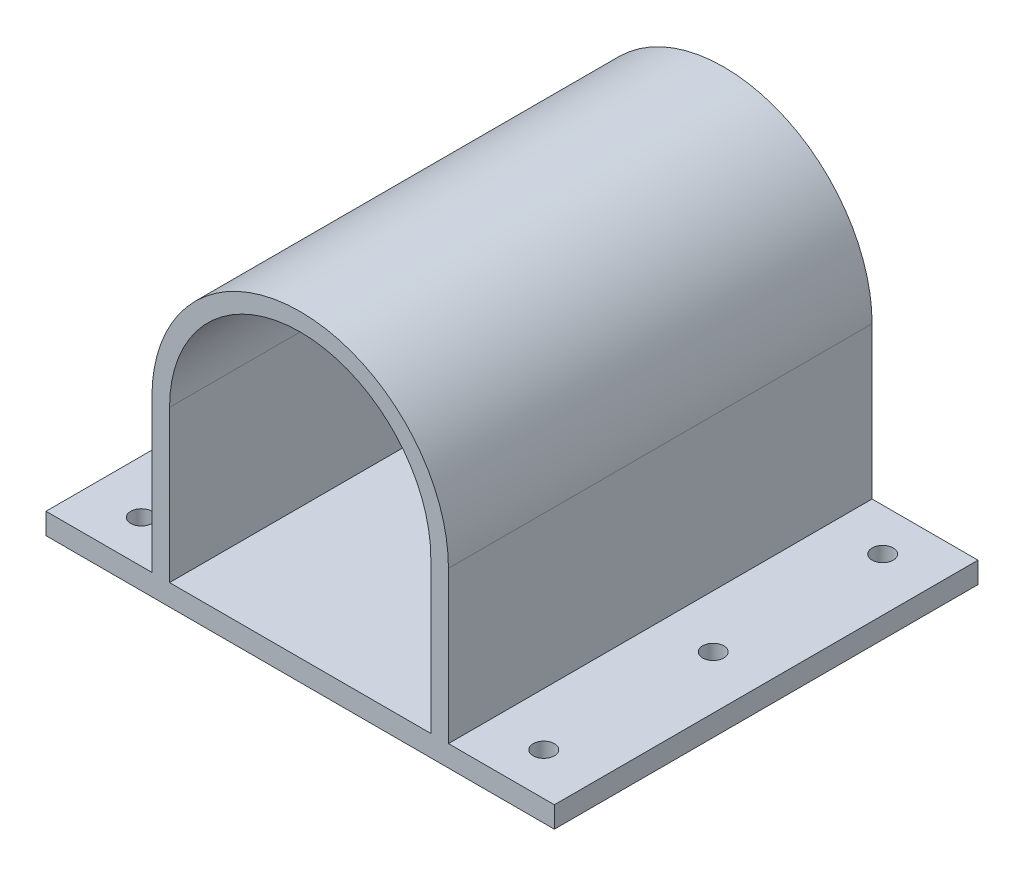
ISO-10303-21;
HEADER;
FILE_DESCRIPTION(('STEP AP214'),'2;1');
FILE_NAME('part.step','',(''),(''),'','','');
FILE_SCHEMA(('AUTOMOTIVE_DESIGN { 1 0 10303 214 1 1 1 1 }'));
ENDSEC;
DATA;
#1=APPLICATION_CONTEXT('core data for automotive mechanical design processes');
#2=APPLICATION_PROTOCOL_DEFINITION('international standard','automotive_design',2000,#1);
#3=PRODUCT_CONTEXT('',#1,'mechanical');
#4=PRODUCT('Part','Part','',(#3));
#5=PRODUCT_RELATED_PRODUCT_CATEGORY('part','',(#4));
#6=PRODUCT_DEFINITION_FORMATION('','',#4);
#7=PRODUCT_DEFINITION_CONTEXT('part definition',#1,'design');
#8=PRODUCT_DEFINITION('design','',#6,#7);
#9=PRODUCT_DEFINITION_SHAPE('','',#8);
#10=(LENGTH_UNIT() NAMED_UNIT(*) SI_UNIT(.MILLI.,.METRE.));
#11=(NAMED_UNIT(*) PLANE_ANGLE_UNIT() SI_UNIT($,.RADIAN.));
#12=(NAMED_UNIT(*) SI_UNIT($,.STERADIAN.) SOLID_ANGLE_UNIT());
#13=UNCERTAINTY_MEASURE_WITH_UNIT(LENGTH_MEASURE(1.E-05),#10,'distance_accuracy_value','');
#14=(GEOMETRIC_REPRESENTATION_CONTEXT(3) GLOBAL_UNCERTAINTY_ASSIGNED_CONTEXT((#13)) GLOBAL_UNIT_ASSIGNED_CONTEXT((#10,
#11,#12)) REPRESENTATION_CONTEXT('',''));
#15=CARTESIAN_POINT('',(0.,0.,0.));
#16=DIRECTION('',(0.,0.,1.));
#17=DIRECTION('',(1.,0.,0.));
#18=AXIS2_PLACEMENT_3D('',#15,#16,#17);
#19=CARTESIAN_POINT('',(0.,-15.5,60.));
#20=DIRECTION('',(0.,0.,-1.));
#21=DIRECTION('',(-1.,0.,0.));
#22=AXIS2_PLACEMENT_3D('',#19,#20,#21);
#23=CYLINDRICAL_SURFACE('',#22,1.65);
#24=CARTESIAN_POINT('',(0.,-15.5,0.));
#25=DIRECTION('',(0.,0.,1.));
#26=DIRECTION('',(1.,0.,0.));
#27=AXIS2_PLACEMENT_3D('',#24,#25,#26);
#28=CIRCLE('',#27,1.65);
#29=CARTESIAN_POINT('',(1.65000000000006,-15.5,0.));
#30=VERTEX_POINT('',#29);
#31=EDGE_CURVE('E216',#30,#30,#28,.T.);
#32=ORIENTED_EDGE('',*,*,#31,.F.);
#33=EDGE_LOOP('',(#32));
#34=FACE_BOUND('',#33,.T.);
#35=CARTESIAN_POINT('',(0.,-15.5,3.));
#36=DIRECTION('',(0.,0.,1.));
#37=DIRECTION('',(1.,0.,0.));
#38=AXIS2_PLACEMENT_3D('',#35,#36,#37);
#39=CIRCLE('',#38,1.65);
#40=CARTESIAN_POINT('',(1.65000000000006,-15.5,3.));
#41=VERTEX_POINT('',#40);
#42=EDGE_CURVE('E195',#41,#41,#39,.T.);
#43=ORIENTED_EDGE('',*,*,#42,.T.);
#44=EDGE_LOOP('',(#43));
#45=FACE_BOUND('',#44,.T.);
#46=ADVANCED_FACE('F39',(#34,#45),#23,.F.);
#47=CARTESIAN_POINT('',(-7.,0.,60.));
#48=DIRECTION('',(0.,0.,-1.));
#49=DIRECTION('',(-1.,0.,0.));
#50=AXIS2_PLACEMENT_3D('',#47,#48,#49);
#51=CYLINDRICAL_SURFACE('',#50,6.15);
#52=CARTESIAN_POINT('',(-7.,0.,0.));
#53=DIRECTION('',(0.,0.,1.));
#54=DIRECTION('',(1.,0.,0.));
#55=AXIS2_PLACEMENT_3D('',#52,#53,#54);
#56=CIRCLE('',#55,6.15);
#57=CARTESIAN_POINT('',(-0.85,0.,0.));
#58=VERTEX_POINT('',#57);
#59=EDGE_CURVE('E213',#58,#58,#56,.T.);
#60=ORIENTED_EDGE('',*,*,#59,.F.);
#61=EDGE_LOOP('',(#60));
#62=FACE_BOUND('',#61,.T.);
#63=CARTESIAN_POINT('',(-7.,0.,3.));
#64=DIRECTION('',(0.,0.,1.));
#65=DIRECTION('',(1.,0.,0.));
#66=AXIS2_PLACEMENT_3D('',#63,#64,#65);
#67=CIRCLE('',#66,6.15);
#68=CARTESIAN_POINT('',(-0.85,0.,3.));
#69=VERTEX_POINT('',#68);
#70=EDGE_CURVE('E192',#69,#69,#67,.T.);
#71=ORIENTED_EDGE('',*,*,#70,.T.);
#72=EDGE_LOOP('',(#71));
#73=FACE_BOUND('',#72,.T.);
#74=ADVANCED_FACE('F308',(#62,#73),#51,.F.);
#75=CARTESIAN_POINT('',(-13.4233937586588,-7.75000000000005,60.));
#76=DIRECTION('',(0.,0.,-1.));
#77=DIRECTION('',(-1.,0.,0.));
#78=AXIS2_PLACEMENT_3D('',#75,#76,#77);
#79=CYLINDRICAL_SURFACE('',#78,1.65);
#80=CARTESIAN_POINT('',(-13.4233937586588,-7.75000000000005,0.));
#81=DIRECTION('',(0.,0.,1.));
#82=DIRECTION('',(1.,0.,0.));
#83=AXIS2_PLACEMENT_3D('',#80,#81,#82);
#84=CIRCLE('',#83,1.65);
#85=CARTESIAN_POINT('',(-11.7733937586588,-7.75000000000005,0.));
#86=VERTEX_POINT('',#85);
#87=EDGE_CURVE('E210',#86,#86,#84,.T.);
#88=ORIENTED_EDGE('',*,*,#87,.F.);
#89=EDGE_LOOP('',(#88));
#90=FACE_BOUND('',#89,.T.);
#91=CARTESIAN_POINT('',(-13.4233937586588,-7.75000000000005,3.));
#92=DIRECTION('',(0.,0.,1.));
#93=DIRECTION('',(1.,0.,0.));
#94=AXIS2_PLACEMENT_3D('',#91,#92,#93);
#95=CIRCLE('',#94,1.65);
#96=CARTESIAN_POINT('',(-11.7733937586588,-7.75000000000005,3.));
#97=VERTEX_POINT('',#96);
#98=EDGE_CURVE('E189',#97,#97,#95,.T.);
#99=ORIENTED_EDGE('',*,*,#98,.T.);
#100=EDGE_LOOP('',(#99));
#101=FACE_BOUND('',#100,.T.);
#102=ADVANCED_FACE('F315',(#90,#101),#79,.F.);
#103=CARTESIAN_POINT('',(-13.4233937586588,7.74999999999994,60.));
#104=DIRECTION('',(0.,0.,-1.));
#105=DIRECTION('',(-1.,0.,0.));
#106=AXIS2_PLACEMENT_3D('',#103,#104,#105);
#107=CYLINDRICAL_SURFACE('',#106,1.65);
#108=CARTESIAN_POINT('',(-13.4233937586588,7.74999999999994,0.));
#109=DIRECTION('',(0.,0.,1.));
#110=DIRECTION('',(1.,0.,0.));
#111=AXIS2_PLACEMENT_3D('',#108,#109,#110);
#112=CIRCLE('',#111,1.65);
#113=CARTESIAN_POINT('',(-11.7733937586588,7.74999999999994,0.));
#114=VERTEX_POINT('',#113);
#115=EDGE_CURVE('E207',#114,#114,#112,.T.);
#116=ORIENTED_EDGE('',*,*,#115,.F.);
#117=EDGE_LOOP('',(#116));
#118=FACE_BOUND('',#117,.T.);
#119=CARTESIAN_POINT('',(-13.4233937586588,7.74999999999994,3.));
#120=DIRECTION('',(0.,0.,1.));
#121=DIRECTION('',(1.,0.,0.));
#122=AXIS2_PLACEMENT_3D('',#119,#120,#121);
#123=CIRCLE('',#122,1.65);
#124=CARTESIAN_POINT('',(-11.7733937586588,7.74999999999994,3.));
#125=VERTEX_POINT('',#124);
#126=EDGE_CURVE('E186',#125,#125,#123,.T.);
#127=ORIENTED_EDGE('',*,*,#126,.T.);
#128=EDGE_LOOP('',(#127));
#129=FACE_BOUND('',#128,.T.);
#130=ADVANCED_FACE('F420',(#118,#129),#107,.F.);
#131=CARTESIAN_POINT('',(0.,15.5,60.));
#132=DIRECTION('',(0.,0.,-1.));
#133=DIRECTION('',(-1.,0.,0.));
#134=AXIS2_PLACEMENT_3D('',#131,#132,#133);
#135=CYLINDRICAL_SURFACE('',#134,1.65);
#136=CARTESIAN_POINT('',(0.,15.5,0.));
#137=DIRECTION('',(0.,0.,1.));
#138=DIRECTION('',(1.,0.,0.));
#139=AXIS2_PLACEMENT_3D('',#136,#137,#138);
#140=CIRCLE('',#139,1.65);
#141=CARTESIAN_POINT('',(1.64999999999994,15.5,0.));
#142=VERTEX_POINT('',#141);
#143=EDGE_CURVE('E204',#142,#142,#140,.T.);
#144=ORIENTED_EDGE('',*,*,#143,.F.);
#145=EDGE_LOOP('',(#144));
#146=FACE_BOUND('',#145,.T.);
#147=CARTESIAN_POINT('',(0.,15.5,3.));
#148=DIRECTION('',(0.,0.,1.));
#149=DIRECTION('',(1.,0.,0.));
#150=AXIS2_PLACEMENT_3D('',#147,#148,#149);
#151=CIRCLE('',#150,1.65);
#152=CARTESIAN_POINT('',(1.64999999999994,15.5,3.));
#153=VERTEX_POINT('',#152);
#154=EDGE_CURVE('E183',#153,#153,#151,.T.);
#155=ORIENTED_EDGE('',*,*,#154,.T.);
#156=EDGE_LOOP('',(#155));
#157=FACE_BOUND('',#156,.T.);
#158=ADVANCED_FACE('F416',(#146,#157),#135,.F.);
#159=CARTESIAN_POINT('',(13.4233937586588,7.75000000000006,60.));
#160=DIRECTION('',(0.,0.,-1.));
#161=DIRECTION('',(-1.,0.,0.));
#162=AXIS2_PLACEMENT_3D('',#159,#160,#161);
#163=CYLINDRICAL_SURFACE('',#162,1.65);
#164=CARTESIAN_POINT('',(13.4233937586588,7.75000000000006,0.));
#165=DIRECTION('',(0.,0.,1.));
#166=DIRECTION('',(1.,0.,0.));
#167=AXIS2_PLACEMENT_3D('',#164,#165,#166);
#168=CIRCLE('',#167,1.65);
#169=CARTESIAN_POINT('',(15.0733937586588,7.75000000000006,0.));
#170=VERTEX_POINT('',#169);
#171=EDGE_CURVE('E201',#170,#170,#168,.T.);
#172=ORIENTED_EDGE('',*,*,#171,.F.);
#173=EDGE_LOOP('',(#172));
#174=FACE_BOUND('',#173,.T.);
#175=CARTESIAN_POINT('',(13.4233937586588,7.75000000000006,3.));
#176=DIRECTION('',(0.,0.,1.));
#177=DIRECTION('',(1.,0.,0.));
#178=AXIS2_PLACEMENT_3D('',#175,#176,#177);
#179=CIRCLE('',#178,1.65);
#180=CARTESIAN_POINT('',(15.0733937586588,7.75000000000006,3.));
#181=VERTEX_POINT('',#180);
#182=EDGE_CURVE('E180',#181,#181,#179,.T.);
#183=ORIENTED_EDGE('',*,*,#182,.T.);
#184=EDGE_LOOP('',(#183));
#185=FACE_BOUND('',#184,.T.);
#186=ADVANCED_FACE('F382',(#174,#185),#163,.F.);
#187=CARTESIAN_POINT('',(13.4233937586588,-7.74999999999995,60.));
#188=DIRECTION('',(0.,0.,-1.));
#189=DIRECTION('',(-1.,0.,0.));
#190=AXIS2_PLACEMENT_3D('',#187,#188,#189);
#191=CYLINDRICAL_SURFACE('',#190,1.65);
#192=CARTESIAN_POINT('',(13.4233937586588,-7.74999999999995,0.));
#193=DIRECTION('',(0.,0.,1.));
#194=DIRECTION('',(1.,0.,0.));
#195=AXIS2_PLACEMENT_3D('',#192,#193,#194);
#196=CIRCLE('',#195,1.65);
#197=CARTESIAN_POINT('',(15.0733937586588,-7.74999999999995,0.));
#198=VERTEX_POINT('',#197);
#199=EDGE_CURVE('E198',#198,#198,#196,.T.);
#200=ORIENTED_EDGE('',*,*,#199,.F.);
#201=EDGE_LOOP('',(#200));
#202=FACE_BOUND('',#201,.T.);
#203=CARTESIAN_POINT('',(13.4233937586588,-7.74999999999995,3.));
#204=DIRECTION('',(0.,0.,1.));
#205=DIRECTION('',(1.,0.,0.));
#206=AXIS2_PLACEMENT_3D('',#203,#204,#205);
#207=CIRCLE('',#206,1.65);
#208=CARTESIAN_POINT('',(15.0733937586588,-7.74999999999995,3.));
#209=VERTEX_POINT('',#208);
#210=EDGE_CURVE('E176',#209,#209,#207,.T.);
#211=ORIENTED_EDGE('',*,*,#210,.T.);
#212=EDGE_LOOP('',(#211));
#213=FACE_BOUND('',#212,.T.);
#214=ADVANCED_FACE('F325',(#202,#213),#191,.F.);
#215=CARTESIAN_POINT('',(0.,0.,60.));
#216=DIRECTION('',(0.,0.,1.));
#217=DIRECTION('',(1.,0.,0.));
#218=AXIS2_PLACEMENT_3D('',#215,#216,#217);
#219=PLANE('',#218);
#220=CARTESIAN_POINT('',(0.,0.,60.));
#221=DIRECTION('',(0.,0.,1.));
#222=DIRECTION('',(1.,0.,0.));
#223=AXIS2_PLACEMENT_3D('',#220,#221,#222);
#224=CIRCLE('',#223,18.5);
#225=CARTESIAN_POINT('',(18.5,0.,60.));
#226=VERTEX_POINT('',#225);
#227=CARTESIAN_POINT('',(-18.5,0.,60.));
#228=VERTEX_POINT('',#227);
#229=EDGE_CURVE('E140',#226,#228,#224,.T.);
#230=ORIENTED_EDGE('',*,*,#229,.F.);
#231=DIRECTION('',(0.,1.,0.));
#232=VECTOR('',#231,1.);
#233=CARTESIAN_POINT('',(18.5,-21.5,60.));
#234=LINE('',#233,#232);
#235=CARTESIAN_POINT('',(18.5,-21.5,60.));
#236=VERTEX_POINT('',#235);
#237=EDGE_CURVE('E157',#236,#226,#234,.T.);
#238=ORIENTED_EDGE('',*,*,#237,.F.);
#239=DIRECTION('',(1.,0.,0.));
#240=VECTOR('',#239,1.);
#241=CARTESIAN_POINT('',(-18.5,-21.5,60.));
#242=LINE('',#241,#240);
#243=CARTESIAN_POINT('',(-18.5,-21.5,60.));
#244=VERTEX_POINT('',#243);
#245=EDGE_CURVE('E160',#244,#236,#242,.T.);
#246=ORIENTED_EDGE('',*,*,#245,.F.);
#247=DIRECTION('',(0.,-1.,0.));
#248=VECTOR('',#247,1.);
#249=CARTESIAN_POINT('',(-18.5,0.,60.));
#250=LINE('',#249,#248);
#251=EDGE_CURVE('E169',#228,#244,#250,.T.);
#252=ORIENTED_EDGE('',*,*,#251,.F.);
#253=EDGE_LOOP('',(#230,#238,#246,#252));
#254=FACE_BOUND('',#253,.T.);
#255=CARTESIAN_POINT('',(0.,0.,60.));
#256=DIRECTION('',(0.,0.,1.));
#257=DIRECTION('',(1.,0.,0.));
#258=AXIS2_PLACEMENT_3D('',#255,#256,#257);
#259=CIRCLE('',#258,21.);
#260=CARTESIAN_POINT('',(21.,0.,60.));
#261=VERTEX_POINT('',#260);
#262=CARTESIAN_POINT('',(-21.,0.,60.));
#263=VERTEX_POINT('',#262);
#264=EDGE_CURVE('E220',#261,#263,#259,.T.);
#265=ORIENTED_EDGE('',*,*,#264,.T.);
#266=DIRECTION('',(0.,-1.,0.));
#267=VECTOR('',#266,1.);
#268=CARTESIAN_POINT('',(-21.,0.,60.));
#269=LINE('',#268,#267);
#270=CARTESIAN_POINT('',(-21.,-21.5,60.));
#271=VERTEX_POINT('',#270);
#272=EDGE_CURVE('E223',#263,#271,#269,.T.);
#273=ORIENTED_EDGE('',*,*,#272,.T.);
#274=DIRECTION('',(-1.,0.,0.));
#275=VECTOR('',#274,1.);
#276=CARTESIAN_POINT('',(-21.,-21.5,60.));
#277=LINE('',#276,#275);
#278=CARTESIAN_POINT('',(-36.,-21.5,60.));
#279=VERTEX_POINT('',#278);
#280=EDGE_CURVE('E226',#271,#279,#277,.T.);
#281=ORIENTED_EDGE('',*,*,#280,.T.);
#282=DIRECTION('',(0.,-1.,0.));
#283=VECTOR('',#282,1.);
#284=CARTESIAN_POINT('',(-36.,-21.5,60.));
#285=LINE('',#284,#283);
#286=CARTESIAN_POINT('',(-36.,-24.5,60.));
#287=VERTEX_POINT('',#286);
#288=EDGE_CURVE('E228',#279,#287,#285,.T.);
#289=ORIENTED_EDGE('',*,*,#288,.T.);
#290=DIRECTION('',(1.,0.,0.));
#291=VECTOR('',#290,1.);
#292=CARTESIAN_POINT('',(-36.,-24.5,60.));
#293=LINE('',#292,#291);
#294=CARTESIAN_POINT('',(36.,-24.5,60.));
#295=VERTEX_POINT('',#294);
#296=EDGE_CURVE('E230',#287,#295,#293,.T.);
#297=ORIENTED_EDGE('',*,*,#296,.T.);
#298=DIRECTION('',(0.,1.,0.));
#299=VECTOR('',#298,1.);
#300=CARTESIAN_POINT('',(36.,-24.5,60.));
#301=LINE('',#300,#299);
#302=CARTESIAN_POINT('',(36.,-21.5,60.));
#303=VERTEX_POINT('',#302);
#304=EDGE_CURVE('E232',#295,#303,#301,.T.);
#305=ORIENTED_EDGE('',*,*,#304,.T.);
#306=DIRECTION('',(-1.,0.,0.));
#307=VECTOR('',#306,1.);
#308=CARTESIAN_POINT('',(36.,-21.5,60.));
#309=LINE('',#308,#307);
#310=CARTESIAN_POINT('',(21.,-21.5,60.));
#311=VERTEX_POINT('',#310);
#312=EDGE_CURVE('E234',#303,#311,#309,.T.);
#313=ORIENTED_EDGE('',*,*,#312,.T.);
#314=DIRECTION('',(0.,1.,0.));
#315=VECTOR('',#314,1.);
#316=CARTESIAN_POINT('',(21.,-21.5,60.));
#317=LINE('',#316,#315);
#318=EDGE_CURVE('E236',#311,#261,#317,.T.);
#319=ORIENTED_EDGE('',*,*,#318,.T.);
#320=EDGE_LOOP('',(#265,#273,#281,#289,#297,#305,#313,#319));
#321=FACE_BOUND('',#320,.T.);
#322=ADVANCED_FACE('F292',(#254,#321),#219,.T.);
#323=CARTESIAN_POINT('',(0.,0.,0.));
#324=DIRECTION('',(0.,0.,1.));
#325=DIRECTION('',(1.,0.,0.));
#326=AXIS2_PLACEMENT_3D('',#323,#324,#325);
#327=PLANE('',#326);
#328=DIRECTION('',(1.,0.,0.));
#329=VECTOR('',#328,1.);
#330=CARTESIAN_POINT('',(-36.,-24.5,0.));
#331=LINE('',#330,#329);
#332=CARTESIAN_POINT('',(-30.,-24.5,0.));
#333=VERTEX_POINT('',#332);
#334=CARTESIAN_POINT('',(36.,-24.5,0.));
#335=VERTEX_POINT('',#334);
#336=EDGE_CURVE('E245',#333,#335,#331,.T.);
#337=ORIENTED_EDGE('',*,*,#336,.F.);
#338=DIRECTION('',(0.,-1.,0.));
#339=VECTOR('',#338,1.);
#340=CARTESIAN_POINT('',(-30.,0.,0.));
#341=LINE('',#340,#339);
#342=CARTESIAN_POINT('',(-30.,-21.5,0.));
#343=VERTEX_POINT('',#342);
#344=EDGE_CURVE('E47',#333,#343,#341,.F.);
#345=ORIENTED_EDGE('',*,*,#344,.T.);
#346=DIRECTION('',(-1.,0.,0.));
#347=VECTOR('',#346,1.);
#348=CARTESIAN_POINT('',(-21.,-21.5,0.));
#349=LINE('',#348,#347);
#350=CARTESIAN_POINT('',(-21.,-21.5,0.));
#351=VERTEX_POINT('',#350);
#352=EDGE_CURVE('E243',#351,#343,#349,.T.);
#353=ORIENTED_EDGE('',*,*,#352,.F.);
#354=DIRECTION('',(0.,-1.,0.));
#355=VECTOR('',#354,1.);
#356=CARTESIAN_POINT('',(-21.,0.,0.));
#357=LINE('',#356,#355);
#358=CARTESIAN_POINT('',(-21.,0.,0.));
#359=VERTEX_POINT('',#358);
#360=EDGE_CURVE('E241',#359,#351,#357,.T.);
#361=ORIENTED_EDGE('',*,*,#360,.F.);
#362=CARTESIAN_POINT('',(0.,0.,0.));
#363=DIRECTION('',(0.,0.,1.));
#364=DIRECTION('',(1.,0.,0.));
#365=AXIS2_PLACEMENT_3D('',#362,#363,#364);
#366=CIRCLE('',#365,21.);
#367=CARTESIAN_POINT('',(21.,0.,0.));
#368=VERTEX_POINT('',#367);
#369=EDGE_CURVE('E219',#368,#359,#366,.T.);
#370=ORIENTED_EDGE('',*,*,#369,.F.);
#371=DIRECTION('',(0.,1.,0.));
#372=VECTOR('',#371,1.);
#373=CARTESIAN_POINT('',(21.,-21.5,0.));
#374=LINE('',#373,#372);
#375=CARTESIAN_POINT('',(21.,-21.5,0.));
#376=VERTEX_POINT('',#375);
#377=EDGE_CURVE('E224',#376,#368,#374,.T.);
#378=ORIENTED_EDGE('',*,*,#377,.F.);
#379=DIRECTION('',(-1.,0.,0.));
#380=VECTOR('',#379,1.);
#381=CARTESIAN_POINT('',(36.,-21.5,0.));
#382=LINE('',#381,#380);
#383=CARTESIAN_POINT('',(36.,-21.5,0.));
#384=VERTEX_POINT('',#383);
#385=EDGE_CURVE('E249',#384,#376,#382,.T.);
#386=ORIENTED_EDGE('',*,*,#385,.F.);
#387=DIRECTION('',(0.,1.,0.));
#388=VECTOR('',#387,1.);
#389=CARTESIAN_POINT('',(36.,-24.5,0.));
#390=LINE('',#389,#388);
#391=EDGE_CURVE('E247',#335,#384,#390,.T.);
#392=ORIENTED_EDGE('',*,*,#391,.F.);
#393=EDGE_LOOP('',(#337,#345,#353,#361,#370,#378,#386,#392));
#394=FACE_BOUND('',#393,.T.);
#395=ORIENTED_EDGE('',*,*,#31,.T.);
#396=EDGE_LOOP('',(#395));
#397=FACE_BOUND('',#396,.T.);
#398=ORIENTED_EDGE('',*,*,#59,.T.);
#399=EDGE_LOOP('',(#398));
#400=FACE_BOUND('',#399,.T.);
#401=ORIENTED_EDGE('',*,*,#87,.T.);
#402=EDGE_LOOP('',(#401));
#403=FACE_BOUND('',#402,.T.);
#404=ORIENTED_EDGE('',*,*,#115,.T.);
#405=EDGE_LOOP('',(#404));
#406=FACE_BOUND('',#405,.T.);
#407=ORIENTED_EDGE('',*,*,#143,.T.);
#408=EDGE_LOOP('',(#407));
#409=FACE_BOUND('',#408,.T.);
#410=ORIENTED_EDGE('',*,*,#171,.T.);
#411=EDGE_LOOP('',(#410));
#412=FACE_BOUND('',#411,.T.);
#413=ORIENTED_EDGE('',*,*,#199,.T.);
#414=EDGE_LOOP('',(#413));
#415=FACE_BOUND('',#414,.T.);
#416=ADVANCED_FACE('F324',(#394,#397,#400,#403,#406,#409,#412,#415),#327,.F.);
#417=CARTESIAN_POINT('',(0.,0.,60.));
#418=DIRECTION('',(0.,0.,-1.));
#419=DIRECTION('',(-1.,0.,0.));
#420=AXIS2_PLACEMENT_3D('',#417,#418,#419);
#421=CYLINDRICAL_SURFACE('',#420,21.);
#422=ORIENTED_EDGE('',*,*,#369,.T.);
#423=DIRECTION('',(0.,0.,-1.));
#424=VECTOR('',#423,1.);
#425=CARTESIAN_POINT('',(-21.,0.,60.));
#426=LINE('',#425,#424);
#427=EDGE_CURVE('E271',#263,#359,#426,.T.);
#428=ORIENTED_EDGE('',*,*,#427,.F.);
#429=ORIENTED_EDGE('',*,*,#264,.F.);
#430=DIRECTION('',(0.,0.,-1.));
#431=VECTOR('',#430,1.);
#432=CARTESIAN_POINT('',(21.,0.,60.));
#433=LINE('',#432,#431);
#434=EDGE_CURVE('E238',#261,#368,#433,.T.);
#435=ORIENTED_EDGE('',*,*,#434,.T.);
#436=EDGE_LOOP('',(#422,#428,#429,#435));
#437=FACE_BOUND('',#436,.T.);
#438=ADVANCED_FACE('F329',(#437),#421,.T.);
#439=CARTESIAN_POINT('',(-21.,0.,60.));
#440=DIRECTION('',(1.,0.,0.));
#441=DIRECTION('',(0.,1.,0.));
#442=AXIS2_PLACEMENT_3D('',#439,#440,#441);
#443=PLANE('',#442);
#444=ORIENTED_EDGE('',*,*,#360,.T.);
#445=DIRECTION('',(0.,0.,-1.));
#446=VECTOR('',#445,1.);
#447=CARTESIAN_POINT('',(-21.,-21.5,60.));
#448=LINE('',#447,#446);
#449=EDGE_CURVE('E268',#271,#351,#448,.T.);
#450=ORIENTED_EDGE('',*,*,#449,.F.);
#451=ORIENTED_EDGE('',*,*,#272,.F.);
#452=ORIENTED_EDGE('',*,*,#427,.T.);
#453=EDGE_LOOP('',(#444,#450,#451,#452));
#454=FACE_BOUND('',#453,.T.);
#455=ADVANCED_FACE('F347',(#454),#443,.F.);
#456=CARTESIAN_POINT('',(-21.,-21.5,60.));
#457=DIRECTION('',(0.,-1.,0.));
#458=DIRECTION('',(0.,0.,-1.));
#459=AXIS2_PLACEMENT_3D('',#456,#457,#458);
#460=PLANE('',#459);
#461=CARTESIAN_POINT('',(-28.5,-21.5,6.));
#462=DIRECTION('',(0.,1.,0.));
#463=DIRECTION('',(0.,0.,1.));
#464=AXIS2_PLACEMENT_3D('',#461,#462,#463);
#465=CIRCLE('',#464,1.5);
#466=CARTESIAN_POINT('',(-28.5,-21.5,7.5));
#467=VERTEX_POINT('',#466);
#468=EDGE_CURVE('E626',#467,#467,#465,.T.);
#469=ORIENTED_EDGE('',*,*,#468,.F.);
#470=EDGE_LOOP('',(#469));
#471=FACE_BOUND('',#470,.T.);
#472=CARTESIAN_POINT('',(-28.5,-21.5,54.));
#473=DIRECTION('',(0.,1.,0.));
#474=DIRECTION('',(0.,0.,1.));
#475=AXIS2_PLACEMENT_3D('',#472,#473,#474);
#476=CIRCLE('',#475,1.5);
#477=CARTESIAN_POINT('',(-28.5,-21.5,55.5));
#478=VERTEX_POINT('',#477);
#479=EDGE_CURVE('E621',#478,#478,#476,.T.);
#480=ORIENTED_EDGE('',*,*,#479,.F.);
#481=EDGE_LOOP('',(#480));
#482=FACE_BOUND('',#481,.T.);
#483=CARTESIAN_POINT('',(-28.5,-21.5,30.));
#484=DIRECTION('',(0.,1.,0.));
#485=DIRECTION('',(0.,0.,1.));
#486=AXIS2_PLACEMENT_3D('',#483,#484,#485);
#487=CIRCLE('',#486,1.5);
#488=CARTESIAN_POINT('',(-28.5,-21.5,31.5));
#489=VERTEX_POINT('',#488);
#490=EDGE_CURVE('E163',#489,#489,#487,.T.);
#491=ORIENTED_EDGE('',*,*,#490,.F.);
#492=EDGE_LOOP('',(#491));
#493=FACE_BOUND('',#492,.T.);
#494=ORIENTED_EDGE('',*,*,#352,.T.);
#495=CARTESIAN_POINT('',(-30.,-21.5,6.));
#496=DIRECTION('',(0.,-1.,0.));
#497=DIRECTION('',(0.,0.,-1.));
#498=AXIS2_PLACEMENT_3D('',#495,#496,#497);
#499=CIRCLE('',#498,6.);
#500=CARTESIAN_POINT('',(-36.,-21.5,6.));
#501=VERTEX_POINT('',#500);
#502=EDGE_CURVE('E11',#343,#501,#499,.F.);
#503=ORIENTED_EDGE('',*,*,#502,.T.);
#504=DIRECTION('',(0.,0.,-1.));
#505=VECTOR('',#504,1.);
#506=CARTESIAN_POINT('',(-36.,-21.5,60.));
#507=LINE('',#506,#505);
#508=EDGE_CURVE('E265',#279,#501,#507,.T.);
#509=ORIENTED_EDGE('',*,*,#508,.F.);
#510=ORIENTED_EDGE('',*,*,#280,.F.);
#511=ORIENTED_EDGE('',*,*,#449,.T.);
#512=EDGE_LOOP('',(#494,#503,#509,#510,#511));
#513=FACE_BOUND('',#512,.T.);
#514=ADVANCED_FACE('F297',(#471,#482,#493,#513),#460,.F.);
#515=CARTESIAN_POINT('',(-36.,-21.5,60.));
#516=DIRECTION('',(1.,0.,0.));
#517=DIRECTION('',(0.,0.,-1.));
#518=AXIS2_PLACEMENT_3D('',#515,#516,#517);
#519=PLANE('',#518);
#520=ORIENTED_EDGE('',*,*,#508,.T.);
#521=DIRECTION('',(0.,-1.,0.));
#522=VECTOR('',#521,1.);
#523=CARTESIAN_POINT('',(-36.,-21.5,6.));
#524=LINE('',#523,#522);
#525=CARTESIAN_POINT('',(-36.,-24.5,6.));
#526=VERTEX_POINT('',#525);
#527=EDGE_CURVE('E274',#501,#526,#524,.T.);
#528=ORIENTED_EDGE('',*,*,#527,.T.);
#529=DIRECTION('',(0.,0.,-1.));
#530=VECTOR('',#529,1.);
#531=CARTESIAN_POINT('',(-36.,-24.5,60.));
#532=LINE('',#531,#530);
#533=EDGE_CURVE('E263',#287,#526,#532,.T.);
#534=ORIENTED_EDGE('',*,*,#533,.F.);
#535=ORIENTED_EDGE('',*,*,#288,.F.);
#536=EDGE_LOOP('',(#520,#528,#534,#535));
#537=FACE_BOUND('',#536,.T.);
#538=ADVANCED_FACE('F282',(#537),#519,.F.);
#539=CARTESIAN_POINT('',(-36.,-24.5,60.));
#540=DIRECTION('',(0.,1.,0.));
#541=DIRECTION('',(0.,0.,1.));
#542=AXIS2_PLACEMENT_3D('',#539,#540,#541);
#543=PLANE('',#542);
#544=CARTESIAN_POINT('',(-28.5,-24.5,6.));
#545=DIRECTION('',(0.,1.,0.));
#546=DIRECTION('',(0.,0.,1.));
#547=AXIS2_PLACEMENT_3D('',#544,#545,#546);
#548=CIRCLE('',#547,1.5);
#549=CARTESIAN_POINT('',(-28.5,-24.5,7.5));
#550=VERTEX_POINT('',#549);
#551=EDGE_CURVE('E623',#550,#550,#548,.T.);
#552=ORIENTED_EDGE('',*,*,#551,.T.);
#553=EDGE_LOOP('',(#552));
#554=FACE_BOUND('',#553,.T.);
#555=CARTESIAN_POINT('',(-28.5,-24.5,54.));
#556=DIRECTION('',(0.,1.,0.));
#557=DIRECTION('',(0.,0.,1.));
#558=AXIS2_PLACEMENT_3D('',#555,#556,#557);
#559=CIRCLE('',#558,1.5);
#560=CARTESIAN_POINT('',(-28.5,-24.5,55.5));
#561=VERTEX_POINT('',#560);
#562=EDGE_CURVE('E618',#561,#561,#559,.T.);
#563=ORIENTED_EDGE('',*,*,#562,.T.);
#564=EDGE_LOOP('',(#563));
#565=FACE_BOUND('',#564,.T.);
#566=CARTESIAN_POINT('',(28.5,-24.5,54.));
#567=DIRECTION('',(0.,1.,0.));
#568=DIRECTION('',(0.,0.,-1.));
#569=AXIS2_PLACEMENT_3D('',#566,#567,#568);
#570=CIRCLE('',#569,1.5);
#571=CARTESIAN_POINT('',(28.5,-24.5,52.5));
#572=VERTEX_POINT('',#571);
#573=EDGE_CURVE('E634',#572,#572,#570,.T.);
#574=ORIENTED_EDGE('',*,*,#573,.T.);
#575=EDGE_LOOP('',(#574));
#576=FACE_BOUND('',#575,.T.);
#577=CARTESIAN_POINT('',(28.5,-24.5,6.00000000000001));
#578=DIRECTION('',(0.,1.,0.));
#579=DIRECTION('',(0.,0.,-1.));
#580=AXIS2_PLACEMENT_3D('',#577,#578,#579);
#581=CIRCLE('',#580,1.5);
#582=CARTESIAN_POINT('',(28.5,-24.5,4.50000000000001));
#583=VERTEX_POINT('',#582);
#584=EDGE_CURVE('E640',#583,#583,#581,.T.);
#585=ORIENTED_EDGE('',*,*,#584,.T.);
#586=EDGE_LOOP('',(#585));
#587=FACE_BOUND('',#586,.T.);
#588=CARTESIAN_POINT('',(28.5,-24.5,30.));
#589=DIRECTION('',(0.,1.,0.));
#590=DIRECTION('',(0.,0.,-1.));
#591=AXIS2_PLACEMENT_3D('',#588,#589,#590);
#592=CIRCLE('',#591,1.5);
#593=CARTESIAN_POINT('',(28.5,-24.5,28.5));
#594=VERTEX_POINT('',#593);
#595=EDGE_CURVE('E653',#594,#594,#592,.T.);
#596=ORIENTED_EDGE('',*,*,#595,.T.);
#597=EDGE_LOOP('',(#596));
#598=FACE_BOUND('',#597,.T.);
#599=CARTESIAN_POINT('',(-28.5,-24.5,30.));
#600=DIRECTION('',(0.,1.,0.));
#601=DIRECTION('',(0.,0.,1.));
#602=AXIS2_PLACEMENT_3D('',#599,#600,#601);
#603=CIRCLE('',#602,1.5);
#604=CARTESIAN_POINT('',(-28.5,-24.5,31.5));
#605=VERTEX_POINT('',#604);
#606=EDGE_CURVE('E170',#605,#605,#603,.T.);
#607=ORIENTED_EDGE('',*,*,#606,.T.);
#608=EDGE_LOOP('',(#607));
#609=FACE_BOUND('',#608,.T.);
#610=ORIENTED_EDGE('',*,*,#533,.T.);
#611=CARTESIAN_POINT('',(-30.,-24.5,6.));
#612=DIRECTION('',(0.,1.,0.));
#613=DIRECTION('',(0.,0.,1.));
#614=AXIS2_PLACEMENT_3D('',#611,#612,#613);
#615=CIRCLE('',#614,6.);
#616=EDGE_CURVE('E61',#526,#333,#615,.F.);
#617=ORIENTED_EDGE('',*,*,#616,.T.);
#618=ORIENTED_EDGE('',*,*,#336,.T.);
#619=DIRECTION('',(0.,0.,-1.));
#620=VECTOR('',#619,1.);
#621=CARTESIAN_POINT('',(36.,-24.5,60.));
#622=LINE('',#621,#620);
#623=EDGE_CURVE('E260',#295,#335,#622,.T.);
#624=ORIENTED_EDGE('',*,*,#623,.F.);
#625=ORIENTED_EDGE('',*,*,#296,.F.);
#626=EDGE_LOOP('',(#610,#617,#618,#624,#625));
#627=FACE_BOUND('',#626,.T.);
#628=ADVANCED_FACE('F288',(#554,#565,#576,#587,#598,#609,#627),#543,.F.);
#629=CARTESIAN_POINT('',(36.,-24.5,60.));
#630=DIRECTION('',(-1.,0.,0.));
#631=DIRECTION('',(0.,0.,1.));
#632=AXIS2_PLACEMENT_3D('',#629,#630,#631);
#633=PLANE('',#632);
#634=ORIENTED_EDGE('',*,*,#391,.T.);
#635=DIRECTION('',(0.,0.,-1.));
#636=VECTOR('',#635,1.);
#637=CARTESIAN_POINT('',(36.,-21.5,60.));
#638=LINE('',#637,#636);
#639=EDGE_CURVE('E257',#303,#384,#638,.T.);
#640=ORIENTED_EDGE('',*,*,#639,.F.);
#641=ORIENTED_EDGE('',*,*,#304,.F.);
#642=ORIENTED_EDGE('',*,*,#623,.T.);
#643=EDGE_LOOP('',(#634,#640,#641,#642));
#644=FACE_BOUND('',#643,.T.);
#645=ADVANCED_FACE('F336',(#644),#633,.F.);
#646=CARTESIAN_POINT('',(36.,-21.5,60.));
#647=DIRECTION('',(0.,-1.,0.));
#648=DIRECTION('',(0.,0.,-1.));
#649=AXIS2_PLACEMENT_3D('',#646,#647,#648);
#650=PLANE('',#649);
#651=CARTESIAN_POINT('',(28.5,-21.5,54.));
#652=DIRECTION('',(0.,1.,0.));
#653=DIRECTION('',(0.,0.,-1.));
#654=AXIS2_PLACEMENT_3D('',#651,#652,#653);
#655=CIRCLE('',#654,1.5);
#656=CARTESIAN_POINT('',(28.5,-21.5,52.5));
#657=VERTEX_POINT('',#656);
#658=EDGE_CURVE('E628',#657,#657,#655,.T.);
#659=ORIENTED_EDGE('',*,*,#658,.F.);
#660=EDGE_LOOP('',(#659));
#661=FACE_BOUND('',#660,.T.);
#662=CARTESIAN_POINT('',(28.5,-21.5,6.00000000000001));
#663=DIRECTION('',(0.,1.,0.));
#664=DIRECTION('',(0.,0.,-1.));
#665=AXIS2_PLACEMENT_3D('',#662,#663,#664);
#666=CIRCLE('',#665,1.5);
#667=CARTESIAN_POINT('',(28.5,-21.5,4.50000000000001));
#668=VERTEX_POINT('',#667);
#669=EDGE_CURVE('E637',#668,#668,#666,.T.);
#670=ORIENTED_EDGE('',*,*,#669,.F.);
#671=EDGE_LOOP('',(#670));
#672=FACE_BOUND('',#671,.T.);
#673=CARTESIAN_POINT('',(28.5,-21.5,30.));
#674=DIRECTION('',(0.,1.,0.));
#675=DIRECTION('',(0.,0.,-1.));
#676=AXIS2_PLACEMENT_3D('',#673,#674,#675);
#677=CIRCLE('',#676,1.5);
#678=CARTESIAN_POINT('',(28.5,-21.5,28.5));
#679=VERTEX_POINT('',#678);
#680=EDGE_CURVE('E642',#679,#679,#677,.T.);
#681=ORIENTED_EDGE('',*,*,#680,.F.);
#682=EDGE_LOOP('',(#681));
#683=FACE_BOUND('',#682,.T.);
#684=ORIENTED_EDGE('',*,*,#385,.T.);
#685=DIRECTION('',(0.,0.,-1.));
#686=VECTOR('',#685,1.);
#687=CARTESIAN_POINT('',(21.,-21.5,60.));
#688=LINE('',#687,#686);
#689=EDGE_CURVE('E254',#311,#376,#688,.T.);
#690=ORIENTED_EDGE('',*,*,#689,.F.);
#691=ORIENTED_EDGE('',*,*,#312,.F.);
#692=ORIENTED_EDGE('',*,*,#639,.T.);
#693=EDGE_LOOP('',(#684,#690,#691,#692));
#694=FACE_BOUND('',#693,.T.);
#695=ADVANCED_FACE('F332',(#661,#672,#683,#694),#650,.F.);
#696=CARTESIAN_POINT('',(21.,-21.5,60.));
#697=DIRECTION('',(-1.,0.,0.));
#698=DIRECTION('',(0.,-1.,0.));
#699=AXIS2_PLACEMENT_3D('',#696,#697,#698);
#700=PLANE('',#699);
#701=ORIENTED_EDGE('',*,*,#377,.T.);
#702=ORIENTED_EDGE('',*,*,#434,.F.);
#703=ORIENTED_EDGE('',*,*,#318,.F.);
#704=ORIENTED_EDGE('',*,*,#689,.T.);
#705=EDGE_LOOP('',(#701,#702,#703,#704));
#706=FACE_BOUND('',#705,.T.);
#707=ADVANCED_FACE('F330',(#706),#700,.F.);
#708=CARTESIAN_POINT('',(0.,0.,3.));
#709=DIRECTION('',(0.,0.,1.));
#710=DIRECTION('',(1.,0.,0.));
#711=AXIS2_PLACEMENT_3D('',#708,#709,#710);
#712=CYLINDRICAL_SURFACE('',#711,18.5);
#713=ORIENTED_EDGE('',*,*,#229,.T.);
#714=DIRECTION('',(0.,0.,1.));
#715=VECTOR('',#714,1.);
#716=CARTESIAN_POINT('',(-18.5,0.,3.));
#717=LINE('',#716,#715);
#718=CARTESIAN_POINT('',(-18.5,0.,3.));
#719=VERTEX_POINT('',#718);
#720=EDGE_CURVE('E133',#719,#228,#717,.T.);
#721=ORIENTED_EDGE('',*,*,#720,.F.);
#722=CARTESIAN_POINT('',(0.,0.,3.));
#723=DIRECTION('',(0.,0.,1.));
#724=DIRECTION('',(1.,0.,0.));
#725=AXIS2_PLACEMENT_3D('',#722,#723,#724);
#726=CIRCLE('',#725,18.5);
#727=CARTESIAN_POINT('',(18.5,0.,3.));
#728=VERTEX_POINT('',#727);
#729=EDGE_CURVE('E137',#728,#719,#726,.T.);
#730=ORIENTED_EDGE('',*,*,#729,.F.);
#731=DIRECTION('',(0.,0.,1.));
#732=VECTOR('',#731,1.);
#733=CARTESIAN_POINT('',(18.5,0.,3.));
#734=LINE('',#733,#732);
#735=EDGE_CURVE('E174',#728,#226,#734,.T.);
#736=ORIENTED_EDGE('',*,*,#735,.T.);
#737=EDGE_LOOP('',(#713,#721,#730,#736));
#738=FACE_BOUND('',#737,.T.);
#739=ADVANCED_FACE('F135',(#738),#712,.F.);
#740=CARTESIAN_POINT('',(18.5,-21.5,3.));
#741=DIRECTION('',(1.,0.,0.));
#742=DIRECTION('',(0.,1.,0.));
#743=AXIS2_PLACEMENT_3D('',#740,#741,#742);
#744=PLANE('',#743);
#745=ORIENTED_EDGE('',*,*,#237,.T.);
#746=ORIENTED_EDGE('',*,*,#735,.F.);
#747=DIRECTION('',(0.,1.,0.));
#748=VECTOR('',#747,1.);
#749=CARTESIAN_POINT('',(18.5,-21.5,3.));
#750=LINE('',#749,#748);
#751=CARTESIAN_POINT('',(18.5,-21.5,3.));
#752=VERTEX_POINT('',#751);
#753=EDGE_CURVE('E145',#752,#728,#750,.T.);
#754=ORIENTED_EDGE('',*,*,#753,.F.);
#755=DIRECTION('',(0.,0.,1.));
#756=VECTOR('',#755,1.);
#757=CARTESIAN_POINT('',(18.5,-21.5,3.));
#758=LINE('',#757,#756);
#759=EDGE_CURVE('E177',#752,#236,#758,.T.);
#760=ORIENTED_EDGE('',*,*,#759,.T.);
#761=EDGE_LOOP('',(#745,#746,#754,#760));
#762=FACE_BOUND('',#761,.T.);
#763=ADVANCED_FACE('F405',(#762),#744,.F.);
#764=CARTESIAN_POINT('',(-18.5,-21.5,3.));
#765=DIRECTION('',(0.,-1.,0.));
#766=DIRECTION('',(0.,0.,-1.));
#767=AXIS2_PLACEMENT_3D('',#764,#765,#766);
#768=PLANE('',#767);
#769=ORIENTED_EDGE('',*,*,#245,.T.);
#770=ORIENTED_EDGE('',*,*,#759,.F.);
#771=DIRECTION('',(1.,0.,0.));
#772=VECTOR('',#771,1.);
#773=CARTESIAN_POINT('',(-18.5,-21.5,3.));
#774=LINE('',#773,#772);
#775=CARTESIAN_POINT('',(-18.5,-21.5,3.));
#776=VERTEX_POINT('',#775);
#777=EDGE_CURVE('E153',#776,#752,#774,.T.);
#778=ORIENTED_EDGE('',*,*,#777,.F.);
#779=DIRECTION('',(0.,0.,1.));
#780=VECTOR('',#779,1.);
#781=CARTESIAN_POINT('',(-18.5,-21.5,3.));
#782=LINE('',#781,#780);
#783=EDGE_CURVE('E144',#776,#244,#782,.T.);
#784=ORIENTED_EDGE('',*,*,#783,.T.);
#785=EDGE_LOOP('',(#769,#770,#778,#784));
#786=FACE_BOUND('',#785,.T.);
#787=ADVANCED_FACE('F397',(#786),#768,.F.);
#788=CARTESIAN_POINT('',(-18.5,0.,3.));
#789=DIRECTION('',(-1.,0.,0.));
#790=DIRECTION('',(0.,-1.,0.));
#791=AXIS2_PLACEMENT_3D('',#788,#789,#790);
#792=PLANE('',#791);
#793=ORIENTED_EDGE('',*,*,#251,.T.);
#794=ORIENTED_EDGE('',*,*,#783,.F.);
#795=DIRECTION('',(0.,-1.,0.));
#796=VECTOR('',#795,1.);
#797=CARTESIAN_POINT('',(-18.5,0.,3.));
#798=LINE('',#797,#796);
#799=EDGE_CURVE('E148',#719,#776,#798,.T.);
#800=ORIENTED_EDGE('',*,*,#799,.F.);
#801=ORIENTED_EDGE('',*,*,#720,.T.);
#802=EDGE_LOOP('',(#793,#794,#800,#801));
#803=FACE_BOUND('',#802,.T.);
#804=ADVANCED_FACE('F149',(#803),#792,.F.);
#805=CARTESIAN_POINT('',(0.,0.,3.));
#806=DIRECTION('',(0.,0.,1.));
#807=DIRECTION('',(1.,0.,0.));
#808=AXIS2_PLACEMENT_3D('',#805,#806,#807);
#809=PLANE('',#808);
#810=ORIENTED_EDGE('',*,*,#42,.F.);
#811=EDGE_LOOP('',(#810));
#812=FACE_BOUND('',#811,.T.);
#813=ORIENTED_EDGE('',*,*,#70,.F.);
#814=EDGE_LOOP('',(#813));
#815=FACE_BOUND('',#814,.T.);
#816=ORIENTED_EDGE('',*,*,#98,.F.);
#817=EDGE_LOOP('',(#816));
#818=FACE_BOUND('',#817,.T.);
#819=ORIENTED_EDGE('',*,*,#126,.F.);
#820=EDGE_LOOP('',(#819));
#821=FACE_BOUND('',#820,.T.);
#822=ORIENTED_EDGE('',*,*,#154,.F.);
#823=EDGE_LOOP('',(#822));
#824=FACE_BOUND('',#823,.T.);
#825=ORIENTED_EDGE('',*,*,#182,.F.);
#826=EDGE_LOOP('',(#825));
#827=FACE_BOUND('',#826,.T.);
#828=ORIENTED_EDGE('',*,*,#210,.F.);
#829=EDGE_LOOP('',(#828));
#830=FACE_BOUND('',#829,.T.);
#831=ORIENTED_EDGE('',*,*,#729,.T.);
#832=ORIENTED_EDGE('',*,*,#799,.T.);
#833=ORIENTED_EDGE('',*,*,#777,.T.);
#834=ORIENTED_EDGE('',*,*,#753,.T.);
#835=EDGE_LOOP('',(#831,#832,#833,#834));
#836=FACE_BOUND('',#835,.T.);
#837=ADVANCED_FACE('F155',(#812,#815,#818,#821,#824,#827,#830,#836),#809,.T.);
#838=CARTESIAN_POINT('',(28.5,-24.5,30.));
#839=DIRECTION('',(0.,1.,0.));
#840=DIRECTION('',(0.,0.,1.));
#841=AXIS2_PLACEMENT_3D('',#838,#839,#840);
#842=CYLINDRICAL_SURFACE('',#841,1.5);
#843=ORIENTED_EDGE('',*,*,#595,.F.);
#844=EDGE_LOOP('',(#843));
#845=FACE_BOUND('',#844,.T.);
#846=ORIENTED_EDGE('',*,*,#680,.T.);
#847=EDGE_LOOP('',(#846));
#848=FACE_BOUND('',#847,.T.);
#849=ADVANCED_FACE('F387',(#845,#848),#842,.F.);
#850=CARTESIAN_POINT('',(28.5,-24.5,6.00000000000001));
#851=DIRECTION('',(0.,1.,0.));
#852=DIRECTION('',(0.,0.,1.));
#853=AXIS2_PLACEMENT_3D('',#850,#851,#852);
#854=CYLINDRICAL_SURFACE('',#853,1.5);
#855=ORIENTED_EDGE('',*,*,#584,.F.);
#856=EDGE_LOOP('',(#855));
#857=FACE_BOUND('',#856,.T.);
#858=ORIENTED_EDGE('',*,*,#669,.T.);
#859=EDGE_LOOP('',(#858));
#860=FACE_BOUND('',#859,.T.);
#861=ADVANCED_FACE('F394',(#857,#860),#854,.F.);
#862=CARTESIAN_POINT('',(28.5,-24.5,54.));
#863=DIRECTION('',(0.,1.,0.));
#864=DIRECTION('',(0.,0.,1.));
#865=AXIS2_PLACEMENT_3D('',#862,#863,#864);
#866=CYLINDRICAL_SURFACE('',#865,1.5);
#867=ORIENTED_EDGE('',*,*,#573,.F.);
#868=EDGE_LOOP('',(#867));
#869=FACE_BOUND('',#868,.T.);
#870=ORIENTED_EDGE('',*,*,#658,.T.);
#871=EDGE_LOOP('',(#870));
#872=FACE_BOUND('',#871,.T.);
#873=ADVANCED_FACE('F505',(#869,#872),#866,.F.);
#874=CARTESIAN_POINT('',(-28.5,-24.5,30.));
#875=DIRECTION('',(0.,1.,0.));
#876=DIRECTION('',(0.,0.,1.));
#877=AXIS2_PLACEMENT_3D('',#874,#875,#876);
#878=CYLINDRICAL_SURFACE('',#877,1.5);
#879=ORIENTED_EDGE('',*,*,#606,.F.);
#880=EDGE_LOOP('',(#879));
#881=FACE_BOUND('',#880,.T.);
#882=ORIENTED_EDGE('',*,*,#490,.T.);
#883=EDGE_LOOP('',(#882));
#884=FACE_BOUND('',#883,.T.);
#885=ADVANCED_FACE('F403',(#881,#884),#878,.F.);
#886=CARTESIAN_POINT('',(-28.5,-24.5,54.));
#887=DIRECTION('',(0.,1.,0.));
#888=DIRECTION('',(0.,0.,1.));
#889=AXIS2_PLACEMENT_3D('',#886,#887,#888);
#890=CYLINDRICAL_SURFACE('',#889,1.5);
#891=ORIENTED_EDGE('',*,*,#562,.F.);
#892=EDGE_LOOP('',(#891));
#893=FACE_BOUND('',#892,.T.);
#894=ORIENTED_EDGE('',*,*,#479,.T.);
#895=EDGE_LOOP('',(#894));
#896=FACE_BOUND('',#895,.T.);
#897=ADVANCED_FACE('F304',(#893,#896),#890,.F.);
#898=CARTESIAN_POINT('',(-28.5,-24.5,6.));
#899=DIRECTION('',(0.,1.,0.));
#900=DIRECTION('',(0.,0.,1.));
#901=AXIS2_PLACEMENT_3D('',#898,#899,#900);
#902=CYLINDRICAL_SURFACE('',#901,1.5);
#903=ORIENTED_EDGE('',*,*,#551,.F.);
#904=EDGE_LOOP('',(#903));
#905=FACE_BOUND('',#904,.T.);
#906=ORIENTED_EDGE('',*,*,#468,.T.);
#907=EDGE_LOOP('',(#906));
#908=FACE_BOUND('',#907,.T.);
#909=ADVANCED_FACE('F299',(#905,#908),#902,.F.);
#910=CARTESIAN_POINT('',(-30.,-21.5,6.));
#911=DIRECTION('',(0.,-1.,0.));
#912=DIRECTION('',(0.,0.,-1.));
#913=AXIS2_PLACEMENT_3D('',#910,#911,#912);
#914=CYLINDRICAL_SURFACE('',#913,6.);
#915=ORIENTED_EDGE('',*,*,#502,.F.);
#916=ORIENTED_EDGE('',*,*,#344,.F.);
#917=ORIENTED_EDGE('',*,*,#616,.F.);
#918=ORIENTED_EDGE('',*,*,#527,.F.);
#919=EDGE_LOOP('',(#915,#916,#917,#918));
#920=FACE_BOUND('',#919,.T.);
#921=ADVANCED_FACE('F41',(#920),#914,.T.);
#922=CLOSED_SHELL('',(#46,#74,#102,#130,#158,#186,#214,#322,#416,#438,#455,#514,#538,#628,#645,
#695,#707,#739,#763,#787,#804,#837,#849,#861,#873,#885,#897,#909,#921));
#923=MANIFOLD_SOLID_BREP('B2',#922);
#924=ADVANCED_BREP_SHAPE_REPRESENTATION('',(#18,#923),#14);
#925=SHAPE_DEFINITION_REPRESENTATION(#9,#924);
ENDSEC;
END-ISO-10303-21;
